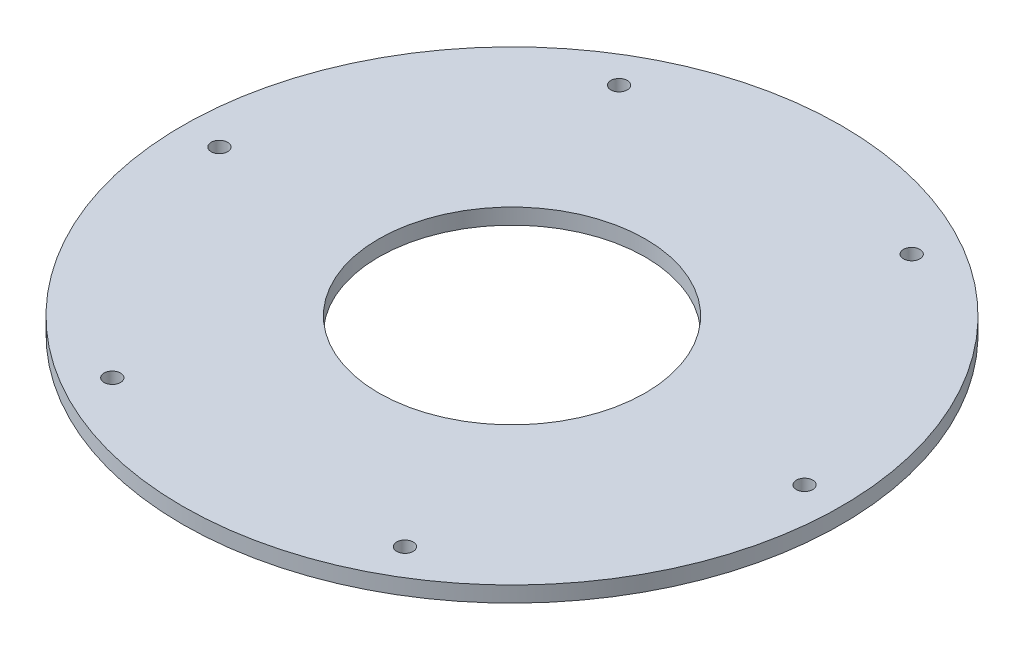
ISO-10303-21;
HEADER;
FILE_DESCRIPTION(('STEP AP214'),'2;1');
FILE_NAME('part.step','',(''),(''),'','','');
FILE_SCHEMA(('AUTOMOTIVE_DESIGN { 1 0 10303 214 1 1 1 1 }'));
ENDSEC;
DATA;
#1=APPLICATION_CONTEXT('core data for automotive mechanical design processes');
#2=APPLICATION_PROTOCOL_DEFINITION('international standard','automotive_design',2000,#1);
#3=PRODUCT_CONTEXT('',#1,'mechanical');
#4=PRODUCT('Part','Part','',(#3));
#5=PRODUCT_RELATED_PRODUCT_CATEGORY('part','',(#4));
#6=PRODUCT_DEFINITION_FORMATION('','',#4);
#7=PRODUCT_DEFINITION_CONTEXT('part definition',#1,'design');
#8=PRODUCT_DEFINITION('design','',#6,#7);
#9=PRODUCT_DEFINITION_SHAPE('','',#8);
#10=(LENGTH_UNIT() NAMED_UNIT(*) SI_UNIT(.MILLI.,.METRE.));
#11=(NAMED_UNIT(*) PLANE_ANGLE_UNIT() SI_UNIT($,.RADIAN.));
#12=(NAMED_UNIT(*) SI_UNIT($,.STERADIAN.) SOLID_ANGLE_UNIT());
#13=UNCERTAINTY_MEASURE_WITH_UNIT(LENGTH_MEASURE(1.E-05),#10,'distance_accuracy_value','');
#14=(GEOMETRIC_REPRESENTATION_CONTEXT(3) GLOBAL_UNCERTAINTY_ASSIGNED_CONTEXT((#13)) GLOBAL_UNIT_ASSIGNED_CONTEXT((#10,
#11,#12)) REPRESENTATION_CONTEXT('',''));
#15=CARTESIAN_POINT('',(0.,0.,0.));
#16=DIRECTION('',(0.,0.,1.));
#17=DIRECTION('',(1.,0.,0.));
#18=AXIS2_PLACEMENT_3D('',#15,#16,#17);
#19=CARTESIAN_POINT('',(0.,2.,0.));
#20=DIRECTION('',(0.,1.,0.));
#21=DIRECTION('',(0.,0.,1.));
#22=AXIS2_PLACEMENT_3D('',#19,#20,#21);
#23=PLANE('',#22);
#24=CARTESIAN_POINT('',(-18.64375,2.,32.2919222436123));
#25=DIRECTION('',(0.,1.,0.));
#26=DIRECTION('',(0.,0.,1.));
#27=AXIS2_PLACEMENT_3D('',#24,#25,#26);
#28=CIRCLE('',#27,1.05);
#29=CARTESIAN_POINT('',(-18.64375,2.,33.3419222436123));
#30=VERTEX_POINT('',#29);
#31=EDGE_CURVE('E75',#30,#30,#28,.T.);
#32=ORIENTED_EDGE('',*,*,#31,.F.);
#33=EDGE_LOOP('',(#32));
#34=FACE_BOUND('',#33,.T.);
#35=CARTESIAN_POINT('',(37.2875,2.,0.));
#36=DIRECTION('',(0.,1.,0.));
#37=DIRECTION('',(0.,0.,1.));
#38=AXIS2_PLACEMENT_3D('',#35,#36,#37);
#39=CIRCLE('',#38,1.05);
#40=CARTESIAN_POINT('',(37.2875,2.,1.05000000000001));
#41=VERTEX_POINT('',#40);
#42=EDGE_CURVE('E63',#41,#41,#39,.T.);
#43=ORIENTED_EDGE('',*,*,#42,.F.);
#44=EDGE_LOOP('',(#43));
#45=FACE_BOUND('',#44,.T.);
#46=CARTESIAN_POINT('',(-18.64375,2.,-32.2919222436122));
#47=DIRECTION('',(0.,1.,0.));
#48=DIRECTION('',(0.,0.,1.));
#49=AXIS2_PLACEMENT_3D('',#46,#47,#48);
#50=CIRCLE('',#49,1.05);
#51=CARTESIAN_POINT('',(-18.64375,2.,-31.2419222436123));
#52=VERTEX_POINT('',#51);
#53=EDGE_CURVE('E51',#52,#52,#50,.T.);
#54=ORIENTED_EDGE('',*,*,#53,.F.);
#55=EDGE_LOOP('',(#54));
#56=FACE_BOUND('',#55,.T.);
#57=CARTESIAN_POINT('',(0.,2.,0.));
#58=DIRECTION('',(0.,1.,0.));
#59=DIRECTION('',(0.,0.,1.));
#60=AXIS2_PLACEMENT_3D('',#57,#58,#59);
#61=CIRCLE('',#60,42.);
#62=CARTESIAN_POINT('',(0.,2.,42.));
#63=VERTEX_POINT('',#62);
#64=EDGE_CURVE('E10',#63,#63,#61,.T.);
#65=ORIENTED_EDGE('',*,*,#64,.T.);
#66=EDGE_LOOP('',(#65));
#67=FACE_BOUND('',#66,.T.);
#68=CARTESIAN_POINT('',(-37.2875,2.,0.));
#69=DIRECTION('',(0.,1.,0.));
#70=DIRECTION('',(0.,0.,1.));
#71=AXIS2_PLACEMENT_3D('',#68,#69,#70);
#72=CIRCLE('',#71,1.05);
#73=CARTESIAN_POINT('',(-37.2875,2.,1.04999999999999));
#74=VERTEX_POINT('',#73);
#75=EDGE_CURVE('E46',#74,#74,#72,.T.);
#76=ORIENTED_EDGE('',*,*,#75,.F.);
#77=EDGE_LOOP('',(#76));
#78=FACE_BOUND('',#77,.T.);
#79=CARTESIAN_POINT('',(18.64375,2.,-32.2919222436122));
#80=DIRECTION('',(0.,1.,0.));
#81=DIRECTION('',(0.,0.,1.));
#82=AXIS2_PLACEMENT_3D('',#79,#80,#81);
#83=CIRCLE('',#82,1.05);
#84=CARTESIAN_POINT('',(18.64375,2.,-31.2419222436123));
#85=VERTEX_POINT('',#84);
#86=EDGE_CURVE('E57',#85,#85,#83,.T.);
#87=ORIENTED_EDGE('',*,*,#86,.F.);
#88=EDGE_LOOP('',(#87));
#89=FACE_BOUND('',#88,.T.);
#90=CARTESIAN_POINT('',(18.64375,2.,32.2919222436123));
#91=DIRECTION('',(0.,1.,0.));
#92=DIRECTION('',(0.,0.,1.));
#93=AXIS2_PLACEMENT_3D('',#90,#91,#92);
#94=CIRCLE('',#93,1.05);
#95=CARTESIAN_POINT('',(18.64375,2.,33.3419222436123));
#96=VERTEX_POINT('',#95);
#97=EDGE_CURVE('E69',#96,#96,#94,.T.);
#98=ORIENTED_EDGE('',*,*,#97,.F.);
#99=EDGE_LOOP('',(#98));
#100=FACE_BOUND('',#99,.T.);
#101=CARTESIAN_POINT('',(0.,2.,0.));
#102=DIRECTION('',(0.,1.,0.));
#103=DIRECTION('',(0.,0.,1.));
#104=AXIS2_PLACEMENT_3D('',#101,#102,#103);
#105=CIRCLE('',#104,17.);
#106=CARTESIAN_POINT('',(0.,2.,17.));
#107=VERTEX_POINT('',#106);
#108=EDGE_CURVE('E81',#107,#107,#105,.T.);
#109=ORIENTED_EDGE('',*,*,#108,.F.);
#110=EDGE_LOOP('',(#109));
#111=FACE_BOUND('',#110,.T.);
#112=ADVANCED_FACE('F35',(#34,#45,#56,#67,#78,#89,#100,#111),#23,.T.);
#113=CARTESIAN_POINT('',(0.,0.,0.));
#114=DIRECTION('',(0.,1.,0.));
#115=DIRECTION('',(0.,0.,1.));
#116=AXIS2_PLACEMENT_3D('',#113,#114,#115);
#117=PLANE('',#116);
#118=CARTESIAN_POINT('',(0.,0.,0.));
#119=DIRECTION('',(0.,1.,0.));
#120=DIRECTION('',(0.,0.,1.));
#121=AXIS2_PLACEMENT_3D('',#118,#119,#120);
#122=CIRCLE('',#121,42.);
#123=CARTESIAN_POINT('',(0.,0.,42.));
#124=VERTEX_POINT('',#123);
#125=EDGE_CURVE('E39',#124,#124,#122,.T.);
#126=ORIENTED_EDGE('',*,*,#125,.F.);
#127=EDGE_LOOP('',(#126));
#128=FACE_BOUND('',#127,.T.);
#129=CARTESIAN_POINT('',(-37.2875,0.,0.));
#130=DIRECTION('',(0.,1.,0.));
#131=DIRECTION('',(0.,0.,1.));
#132=AXIS2_PLACEMENT_3D('',#129,#130,#131);
#133=CIRCLE('',#132,1.05);
#134=CARTESIAN_POINT('',(-37.2875,0.,1.04999999999999));
#135=VERTEX_POINT('',#134);
#136=EDGE_CURVE('E48',#135,#135,#133,.T.);
#137=ORIENTED_EDGE('',*,*,#136,.T.);
#138=EDGE_LOOP('',(#137));
#139=FACE_BOUND('',#138,.T.);
#140=CARTESIAN_POINT('',(-18.64375,0.,-32.2919222436122));
#141=DIRECTION('',(0.,1.,0.));
#142=DIRECTION('',(0.,0.,1.));
#143=AXIS2_PLACEMENT_3D('',#140,#141,#142);
#144=CIRCLE('',#143,1.05);
#145=CARTESIAN_POINT('',(-18.64375,0.,-31.2419222436123));
#146=VERTEX_POINT('',#145);
#147=EDGE_CURVE('E54',#146,#146,#144,.T.);
#148=ORIENTED_EDGE('',*,*,#147,.T.);
#149=EDGE_LOOP('',(#148));
#150=FACE_BOUND('',#149,.T.);
#151=CARTESIAN_POINT('',(18.64375,0.,-32.2919222436122));
#152=DIRECTION('',(0.,1.,0.));
#153=DIRECTION('',(0.,0.,1.));
#154=AXIS2_PLACEMENT_3D('',#151,#152,#153);
#155=CIRCLE('',#154,1.05);
#156=CARTESIAN_POINT('',(18.64375,0.,-31.2419222436123));
#157=VERTEX_POINT('',#156);
#158=EDGE_CURVE('E60',#157,#157,#155,.T.);
#159=ORIENTED_EDGE('',*,*,#158,.T.);
#160=EDGE_LOOP('',(#159));
#161=FACE_BOUND('',#160,.T.);
#162=CARTESIAN_POINT('',(37.2875,0.,0.));
#163=DIRECTION('',(0.,1.,0.));
#164=DIRECTION('',(0.,0.,1.));
#165=AXIS2_PLACEMENT_3D('',#162,#163,#164);
#166=CIRCLE('',#165,1.05);
#167=CARTESIAN_POINT('',(37.2875,0.,1.05000000000001));
#168=VERTEX_POINT('',#167);
#169=EDGE_CURVE('E66',#168,#168,#166,.T.);
#170=ORIENTED_EDGE('',*,*,#169,.T.);
#171=EDGE_LOOP('',(#170));
#172=FACE_BOUND('',#171,.T.);
#173=CARTESIAN_POINT('',(18.64375,0.,32.2919222436123));
#174=DIRECTION('',(0.,1.,0.));
#175=DIRECTION('',(0.,0.,1.));
#176=AXIS2_PLACEMENT_3D('',#173,#174,#175);
#177=CIRCLE('',#176,1.05);
#178=CARTESIAN_POINT('',(18.64375,0.,33.3419222436123));
#179=VERTEX_POINT('',#178);
#180=EDGE_CURVE('E72',#179,#179,#177,.T.);
#181=ORIENTED_EDGE('',*,*,#180,.T.);
#182=EDGE_LOOP('',(#181));
#183=FACE_BOUND('',#182,.T.);
#184=CARTESIAN_POINT('',(-18.64375,0.,32.2919222436123));
#185=DIRECTION('',(0.,1.,0.));
#186=DIRECTION('',(0.,0.,1.));
#187=AXIS2_PLACEMENT_3D('',#184,#185,#186);
#188=CIRCLE('',#187,1.05);
#189=CARTESIAN_POINT('',(-18.64375,0.,33.3419222436123));
#190=VERTEX_POINT('',#189);
#191=EDGE_CURVE('E78',#190,#190,#188,.T.);
#192=ORIENTED_EDGE('',*,*,#191,.T.);
#193=EDGE_LOOP('',(#192));
#194=FACE_BOUND('',#193,.T.);
#195=CARTESIAN_POINT('',(0.,0.,0.));
#196=DIRECTION('',(0.,1.,0.));
#197=DIRECTION('',(0.,0.,1.));
#198=AXIS2_PLACEMENT_3D('',#195,#196,#197);
#199=CIRCLE('',#198,17.);
#200=CARTESIAN_POINT('',(0.,0.,17.));
#201=VERTEX_POINT('',#200);
#202=EDGE_CURVE('E84',#201,#201,#199,.T.);
#203=ORIENTED_EDGE('',*,*,#202,.T.);
#204=EDGE_LOOP('',(#203));
#205=FACE_BOUND('',#204,.T.);
#206=ADVANCED_FACE('F94',(#128,#139,#150,#161,#172,#183,#194,#205),#117,.F.);
#207=CARTESIAN_POINT('',(0.,2.,0.));
#208=DIRECTION('',(0.,-1.,0.));
#209=DIRECTION('',(0.,0.,-1.));
#210=AXIS2_PLACEMENT_3D('',#207,#208,#209);
#211=CYLINDRICAL_SURFACE('',#210,42.);
#212=ORIENTED_EDGE('',*,*,#64,.F.);
#213=EDGE_LOOP('',(#212));
#214=FACE_BOUND('',#213,.T.);
#215=ORIENTED_EDGE('',*,*,#125,.T.);
#216=EDGE_LOOP('',(#215));
#217=FACE_BOUND('',#216,.T.);
#218=ADVANCED_FACE('F37',(#214,#217),#211,.T.);
#219=CARTESIAN_POINT('',(-37.2875,2.,0.));
#220=DIRECTION('',(0.,-1.,0.));
#221=DIRECTION('',(0.,0.,-1.));
#222=AXIS2_PLACEMENT_3D('',#219,#220,#221);
#223=CYLINDRICAL_SURFACE('',#222,1.05);
#224=ORIENTED_EDGE('',*,*,#75,.T.);
#225=EDGE_LOOP('',(#224));
#226=FACE_BOUND('',#225,.T.);
#227=ORIENTED_EDGE('',*,*,#136,.F.);
#228=EDGE_LOOP('',(#227));
#229=FACE_BOUND('',#228,.T.);
#230=ADVANCED_FACE('F104',(#226,#229),#223,.F.);
#231=CARTESIAN_POINT('',(-18.64375,2.,-32.2919222436122));
#232=DIRECTION('',(0.,-1.,0.));
#233=DIRECTION('',(0.,0.,-1.));
#234=AXIS2_PLACEMENT_3D('',#231,#232,#233);
#235=CYLINDRICAL_SURFACE('',#234,1.05);
#236=ORIENTED_EDGE('',*,*,#53,.T.);
#237=EDGE_LOOP('',(#236));
#238=FACE_BOUND('',#237,.T.);
#239=ORIENTED_EDGE('',*,*,#147,.F.);
#240=EDGE_LOOP('',(#239));
#241=FACE_BOUND('',#240,.T.);
#242=ADVANCED_FACE('F107',(#238,#241),#235,.F.);
#243=CARTESIAN_POINT('',(18.64375,2.,-32.2919222436122));
#244=DIRECTION('',(0.,-1.,0.));
#245=DIRECTION('',(0.,0.,-1.));
#246=AXIS2_PLACEMENT_3D('',#243,#244,#245);
#247=CYLINDRICAL_SURFACE('',#246,1.05);
#248=ORIENTED_EDGE('',*,*,#86,.T.);
#249=EDGE_LOOP('',(#248));
#250=FACE_BOUND('',#249,.T.);
#251=ORIENTED_EDGE('',*,*,#158,.F.);
#252=EDGE_LOOP('',(#251));
#253=FACE_BOUND('',#252,.T.);
#254=ADVANCED_FACE('F111',(#250,#253),#247,.F.);
#255=CARTESIAN_POINT('',(37.2875,2.,0.));
#256=DIRECTION('',(0.,-1.,0.));
#257=DIRECTION('',(0.,0.,-1.));
#258=AXIS2_PLACEMENT_3D('',#255,#256,#257);
#259=CYLINDRICAL_SURFACE('',#258,1.05);
#260=ORIENTED_EDGE('',*,*,#42,.T.);
#261=EDGE_LOOP('',(#260));
#262=FACE_BOUND('',#261,.T.);
#263=ORIENTED_EDGE('',*,*,#169,.F.);
#264=EDGE_LOOP('',(#263));
#265=FACE_BOUND('',#264,.T.);
#266=ADVANCED_FACE('F115',(#262,#265),#259,.F.);
#267=CARTESIAN_POINT('',(18.64375,2.,32.2919222436123));
#268=DIRECTION('',(0.,-1.,0.));
#269=DIRECTION('',(0.,0.,-1.));
#270=AXIS2_PLACEMENT_3D('',#267,#268,#269);
#271=CYLINDRICAL_SURFACE('',#270,1.05);
#272=ORIENTED_EDGE('',*,*,#97,.T.);
#273=EDGE_LOOP('',(#272));
#274=FACE_BOUND('',#273,.T.);
#275=ORIENTED_EDGE('',*,*,#180,.F.);
#276=EDGE_LOOP('',(#275));
#277=FACE_BOUND('',#276,.T.);
#278=ADVANCED_FACE('F119',(#274,#277),#271,.F.);
#279=CARTESIAN_POINT('',(-18.64375,2.,32.2919222436123));
#280=DIRECTION('',(0.,-1.,0.));
#281=DIRECTION('',(0.,0.,-1.));
#282=AXIS2_PLACEMENT_3D('',#279,#280,#281);
#283=CYLINDRICAL_SURFACE('',#282,1.05);
#284=ORIENTED_EDGE('',*,*,#31,.T.);
#285=EDGE_LOOP('',(#284));
#286=FACE_BOUND('',#285,.T.);
#287=ORIENTED_EDGE('',*,*,#191,.F.);
#288=EDGE_LOOP('',(#287));
#289=FACE_BOUND('',#288,.T.);
#290=ADVANCED_FACE('F123',(#286,#289),#283,.F.);
#291=CARTESIAN_POINT('',(0.,2.,0.));
#292=DIRECTION('',(0.,-1.,0.));
#293=DIRECTION('',(0.,0.,-1.));
#294=AXIS2_PLACEMENT_3D('',#291,#292,#293);
#295=CYLINDRICAL_SURFACE('',#294,17.);
#296=ORIENTED_EDGE('',*,*,#108,.T.);
#297=EDGE_LOOP('',(#296));
#298=FACE_BOUND('',#297,.T.);
#299=ORIENTED_EDGE('',*,*,#202,.F.);
#300=EDGE_LOOP('',(#299));
#301=FACE_BOUND('',#300,.T.);
#302=ADVANCED_FACE('F90',(#298,#301),#295,.F.);
#303=CLOSED_SHELL('',(#112,#206,#218,#230,#242,#254,#266,#278,#290,#302));
#304=MANIFOLD_SOLID_BREP('B2',#303);
#305=ADVANCED_BREP_SHAPE_REPRESENTATION('',(#18,#304),#14);
#306=SHAPE_DEFINITION_REPRESENTATION(#9,#305);
ENDSEC;
END-ISO-10303-21;
